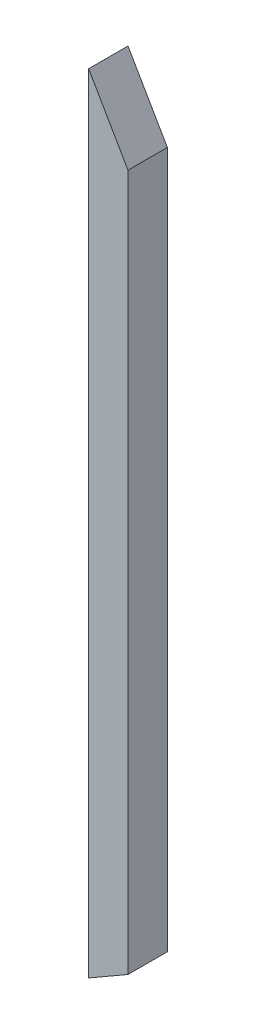
ISO-10303-21;
HEADER;
FILE_DESCRIPTION(('STEP AP214'),'2;1');
FILE_NAME('part.step','',(''),(''),'','','');
FILE_SCHEMA(('AUTOMOTIVE_DESIGN { 1 0 10303 214 1 1 1 1 }'));
ENDSEC;
DATA;
#1=APPLICATION_CONTEXT('core data for automotive mechanical design processes');
#2=APPLICATION_PROTOCOL_DEFINITION('international standard','automotive_design',2000,#1);
#3=PRODUCT_CONTEXT('',#1,'mechanical');
#4=PRODUCT('Part','Part','',(#3));
#5=PRODUCT_RELATED_PRODUCT_CATEGORY('part','',(#4));
#6=PRODUCT_DEFINITION_FORMATION('','',#4);
#7=PRODUCT_DEFINITION_CONTEXT('part definition',#1,'design');
#8=PRODUCT_DEFINITION('design','',#6,#7);
#9=PRODUCT_DEFINITION_SHAPE('','',#8);
#10=(LENGTH_UNIT() NAMED_UNIT(*) SI_UNIT(.MILLI.,.METRE.));
#11=(NAMED_UNIT(*) PLANE_ANGLE_UNIT() SI_UNIT($,.RADIAN.));
#12=(NAMED_UNIT(*) SI_UNIT($,.STERADIAN.) SOLID_ANGLE_UNIT());
#13=UNCERTAINTY_MEASURE_WITH_UNIT(LENGTH_MEASURE(1.E-05),#10,'distance_accuracy_value','');
#14=(GEOMETRIC_REPRESENTATION_CONTEXT(3) GLOBAL_UNCERTAINTY_ASSIGNED_CONTEXT((#13)) GLOBAL_UNIT_ASSIGNED_CONTEXT((#10,
#11,#12)) REPRESENTATION_CONTEXT('',''));
#15=CARTESIAN_POINT('',(0.,0.,0.));
#16=DIRECTION('',(0.,0.,1.));
#17=DIRECTION('',(1.,0.,0.));
#18=AXIS2_PLACEMENT_3D('',#15,#16,#17);
#19=CARTESIAN_POINT('',(0.,600.,0.));
#20=DIRECTION('',(1.,0.,0.));
#21=DIRECTION('',(0.,0.,-1.));
#22=AXIS2_PLACEMENT_3D('',#19,#20,#21);
#23=PLANE('',#22);
#24=DIRECTION('',(0.,0.,1.));
#25=VECTOR('',#24,1.);
#26=CARTESIAN_POINT('',(0.,0.,0.));
#27=LINE('',#26,#25);
#28=CARTESIAN_POINT('',(0.,0.,0.));
#29=VERTEX_POINT('',#28);
#30=CARTESIAN_POINT('',(0.,0.,30.));
#31=VERTEX_POINT('',#30);
#32=EDGE_CURVE('E102',#29,#31,#27,.T.);
#33=ORIENTED_EDGE('',*,*,#32,.T.);
#34=DIRECTION('',(0.,-1.,0.));
#35=VECTOR('',#34,1.);
#36=CARTESIAN_POINT('',(0.,600.,30.));
#37=LINE('',#36,#35);
#38=CARTESIAN_POINT('',(0.,600.,30.));
#39=VERTEX_POINT('',#38);
#40=EDGE_CURVE('E11',#39,#31,#37,.T.);
#41=ORIENTED_EDGE('',*,*,#40,.F.);
#42=DIRECTION('',(0.,0.,1.));
#43=VECTOR('',#42,1.);
#44=CARTESIAN_POINT('',(0.,600.,0.));
#45=LINE('',#44,#43);
#46=CARTESIAN_POINT('',(0.,600.,0.));
#47=VERTEX_POINT('',#46);
#48=EDGE_CURVE('E103',#47,#39,#45,.T.);
#49=ORIENTED_EDGE('',*,*,#48,.F.);
#50=DIRECTION('',(0.,-1.,0.));
#51=VECTOR('',#50,1.);
#52=CARTESIAN_POINT('',(0.,600.,0.));
#53=LINE('',#52,#51);
#54=EDGE_CURVE('E51',#47,#29,#53,.T.);
#55=ORIENTED_EDGE('',*,*,#54,.T.);
#56=EDGE_LOOP('',(#33,#41,#49,#55));
#57=FACE_BOUND('',#56,.T.);
#58=ADVANCED_FACE('F37',(#57),#23,.F.);
#59=CARTESIAN_POINT('',(0.,600.,30.));
#60=DIRECTION('',(0.,0.,-1.));
#61=DIRECTION('',(-1.,0.,0.));
#62=AXIS2_PLACEMENT_3D('',#59,#60,#61);
#63=PLANE('',#62);
#64=ORIENTED_EDGE('',*,*,#40,.T.);
#65=DIRECTION('',(0.866025403784438,0.500000000000001,0.));
#66=VECTOR('',#65,1.);
#67=CARTESIAN_POINT('',(0.,0.,30.));
#68=LINE('',#67,#66);
#69=CARTESIAN_POINT('',(30.,17.3205080756888,30.));
#70=VERTEX_POINT('',#69);
#71=EDGE_CURVE('E96',#31,#70,#68,.T.);
#72=ORIENTED_EDGE('',*,*,#71,.T.);
#73=DIRECTION('',(0.,-1.,0.));
#74=VECTOR('',#73,1.);
#75=CARTESIAN_POINT('',(30.,600.,30.));
#76=LINE('',#75,#74);
#77=CARTESIAN_POINT('',(30.,548.038475772933,30.));
#78=VERTEX_POINT('',#77);
#79=EDGE_CURVE('E45',#78,#70,#76,.T.);
#80=ORIENTED_EDGE('',*,*,#79,.F.);
#81=DIRECTION('',(-0.499999999999995,0.866025403784442,0.));
#82=VECTOR('',#81,1.);
#83=CARTESIAN_POINT('',(0.,600.,30.));
#84=LINE('',#83,#82);
#85=EDGE_CURVE('E90',#78,#39,#84,.T.);
#86=ORIENTED_EDGE('',*,*,#85,.T.);
#87=EDGE_LOOP('',(#64,#72,#80,#86));
#88=FACE_BOUND('',#87,.T.);
#89=ADVANCED_FACE('F108',(#88),#63,.F.);
#90=CARTESIAN_POINT('',(30.,600.,0.));
#91=DIRECTION('',(-1.,0.,0.));
#92=DIRECTION('',(0.,0.,1.));
#93=AXIS2_PLACEMENT_3D('',#90,#91,#92);
#94=PLANE('',#93);
#95=ORIENTED_EDGE('',*,*,#79,.T.);
#96=DIRECTION('',(0.,0.,-1.));
#97=VECTOR('',#96,1.);
#98=CARTESIAN_POINT('',(30.,17.3205080756888,30.));
#99=LINE('',#98,#97);
#100=CARTESIAN_POINT('',(30.,17.3205080756888,0.));
#101=VERTEX_POINT('',#100);
#102=EDGE_CURVE('E81',#70,#101,#99,.T.);
#103=ORIENTED_EDGE('',*,*,#102,.T.);
#104=DIRECTION('',(0.,-1.,0.));
#105=VECTOR('',#104,1.);
#106=CARTESIAN_POINT('',(30.,600.,0.));
#107=LINE('',#106,#105);
#108=CARTESIAN_POINT('',(30.,548.038475772933,0.));
#109=VERTEX_POINT('',#108);
#110=EDGE_CURVE('E76',#109,#101,#107,.T.);
#111=ORIENTED_EDGE('',*,*,#110,.F.);
#112=DIRECTION('',(0.,0.,-1.));
#113=VECTOR('',#112,1.);
#114=CARTESIAN_POINT('',(30.,548.038475772933,145.911099154688));
#115=LINE('',#114,#113);
#116=EDGE_CURVE('E80',#78,#109,#115,.T.);
#117=ORIENTED_EDGE('',*,*,#116,.F.);
#118=EDGE_LOOP('',(#95,#103,#111,#117));
#119=FACE_BOUND('',#118,.T.);
#120=ADVANCED_FACE('F79',(#119),#94,.F.);
#121=CARTESIAN_POINT('',(0.,600.,0.));
#122=DIRECTION('',(0.,0.,1.));
#123=DIRECTION('',(1.,0.,0.));
#124=AXIS2_PLACEMENT_3D('',#121,#122,#123);
#125=PLANE('',#124);
#126=ORIENTED_EDGE('',*,*,#110,.T.);
#127=DIRECTION('',(0.866025403784438,0.500000000000001,0.));
#128=VECTOR('',#127,1.);
#129=CARTESIAN_POINT('',(0.,0.,0.));
#130=LINE('',#129,#128);
#131=EDGE_CURVE('E99',#29,#101,#130,.T.);
#132=ORIENTED_EDGE('',*,*,#131,.F.);
#133=ORIENTED_EDGE('',*,*,#54,.F.);
#134=DIRECTION('',(0.499999999999995,-0.866025403784442,0.));
#135=VECTOR('',#134,1.);
#136=CARTESIAN_POINT('',(0.,600.,0.));
#137=LINE('',#136,#135);
#138=EDGE_CURVE('E88',#47,#109,#137,.T.);
#139=ORIENTED_EDGE('',*,*,#138,.T.);
#140=EDGE_LOOP('',(#126,#132,#133,#139));
#141=FACE_BOUND('',#140,.T.);
#142=ADVANCED_FACE('F92',(#141),#125,.F.);
#143=CARTESIAN_POINT('',(0.,0.,30.));
#144=DIRECTION('',(-0.500000000000001,0.866025403784438,0.));
#145=DIRECTION('',(-0.866025403784438,-0.500000000000001,0.));
#146=AXIS2_PLACEMENT_3D('',#143,#144,#145);
#147=PLANE('',#146);
#148=ORIENTED_EDGE('',*,*,#131,.T.);
#149=ORIENTED_EDGE('',*,*,#102,.F.);
#150=ORIENTED_EDGE('',*,*,#71,.F.);
#151=ORIENTED_EDGE('',*,*,#32,.F.);
#152=EDGE_LOOP('',(#148,#149,#150,#151));
#153=FACE_BOUND('',#152,.T.);
#154=ADVANCED_FACE('F110',(#153),#147,.F.);
#155=CARTESIAN_POINT('',(0.,600.,145.911099154688));
#156=DIRECTION('',(0.866025403784441,0.499999999999995,0.));
#157=DIRECTION('',(-0.499999999999995,0.866025403784442,0.));
#158=AXIS2_PLACEMENT_3D('',#155,#156,#157);
#159=PLANE('',#158);
#160=ORIENTED_EDGE('',*,*,#85,.F.);
#161=ORIENTED_EDGE('',*,*,#116,.T.);
#162=ORIENTED_EDGE('',*,*,#138,.F.);
#163=ORIENTED_EDGE('',*,*,#48,.T.);
#164=EDGE_LOOP('',(#160,#161,#162,#163));
#165=FACE_BOUND('',#164,.T.);
#166=ADVANCED_FACE('F86',(#165),#159,.T.);
#167=CLOSED_SHELL('',(#58,#89,#120,#142,#154,#166));
#168=MANIFOLD_SOLID_BREP('B2',#167);
#169=ADVANCED_BREP_SHAPE_REPRESENTATION('',(#18,#168),#14);
#170=SHAPE_DEFINITION_REPRESENTATION(#9,#169);
ENDSEC;
END-ISO-10303-21;
